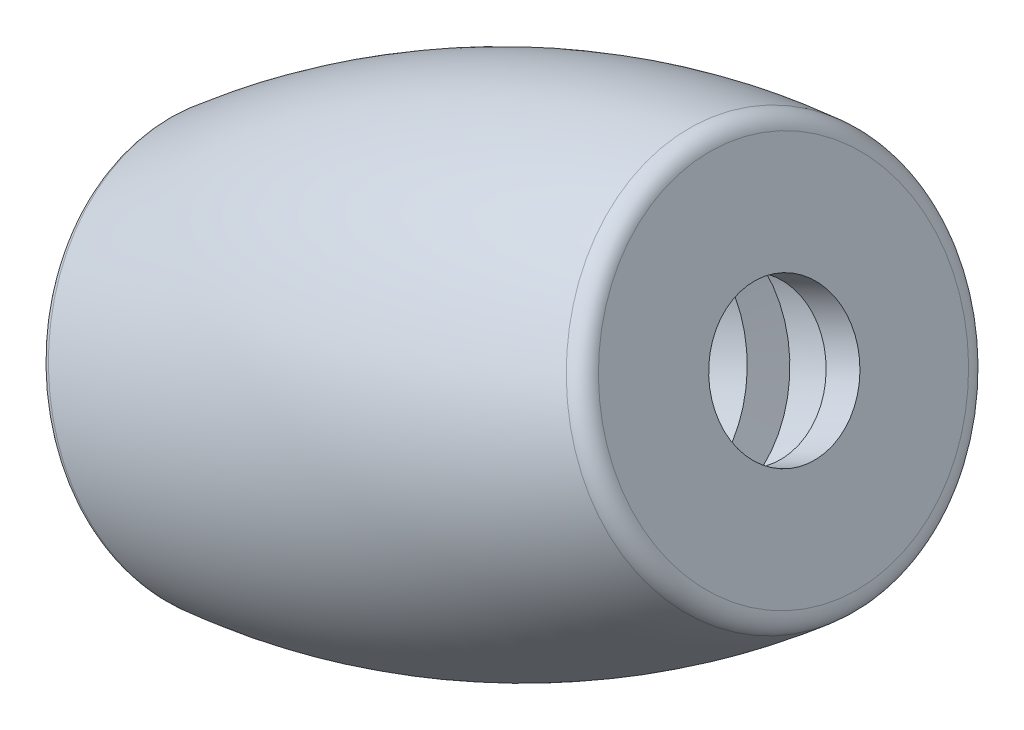
ISO-10303-21;
HEADER;
FILE_DESCRIPTION(('STEP AP214'),'2;1');
FILE_NAME('part.step','',(''),(''),'','','');
FILE_SCHEMA(('AUTOMOTIVE_DESIGN { 1 0 10303 214 1 1 1 1 }'));
ENDSEC;
DATA;
#1=APPLICATION_CONTEXT('core data for automotive mechanical design processes');
#2=APPLICATION_PROTOCOL_DEFINITION('international standard','automotive_design',2000,#1);
#3=PRODUCT_CONTEXT('',#1,'mechanical');
#4=PRODUCT('Part','Part','',(#3));
#5=PRODUCT_RELATED_PRODUCT_CATEGORY('part','',(#4));
#6=PRODUCT_DEFINITION_FORMATION('','',#4);
#7=PRODUCT_DEFINITION_CONTEXT('part definition',#1,'design');
#8=PRODUCT_DEFINITION('design','',#6,#7);
#9=PRODUCT_DEFINITION_SHAPE('','',#8);
#10=(LENGTH_UNIT() NAMED_UNIT(*) SI_UNIT(.MILLI.,.METRE.));
#11=(NAMED_UNIT(*) PLANE_ANGLE_UNIT() SI_UNIT($,.RADIAN.));
#12=(NAMED_UNIT(*) SI_UNIT($,.STERADIAN.) SOLID_ANGLE_UNIT());
#13=UNCERTAINTY_MEASURE_WITH_UNIT(LENGTH_MEASURE(1.E-05),#10,'distance_accuracy_value','');
#14=(GEOMETRIC_REPRESENTATION_CONTEXT(3) GLOBAL_UNCERTAINTY_ASSIGNED_CONTEXT((#13)) GLOBAL_UNIT_ASSIGNED_CONTEXT((#10,
#11,#12)) REPRESENTATION_CONTEXT('',''));
#15=CARTESIAN_POINT('',(0.,0.,0.));
#16=DIRECTION('',(0.,0.,1.));
#17=DIRECTION('',(1.,0.,0.));
#18=AXIS2_PLACEMENT_3D('',#15,#16,#17);
#19=CARTESIAN_POINT('',(10.863694172749,-21.4063109601106,0.));
#20=DIRECTION('',(-0.900968867902419,-0.433883739117558,0.));
#21=DIRECTION('',(0.433883739117558,-0.900968867902419,0.));
#22=AXIS2_PLACEMENT_3D('',#19,#20,#21);
#23=CONICAL_SURFACE('',#22,4.50000000025042,1.48352986418899);
#24=CARTESIAN_POINT('',(10.8636941727726,-21.4063109600992,0.));
#25=DIRECTION('',(0.90096886790242,0.433883739117557,0.));
#26=DIRECTION('',(-0.433883739117557,0.90096886790242,0.));
#27=AXIS2_PLACEMENT_3D('',#24,#25,#26);
#28=CIRCLE('',#27,4.5);
#29=CARTESIAN_POINT('',(8.9112173467436,-17.3519510545383,0.));
#30=VERTEX_POINT('',#29);
#31=EDGE_CURVE('E20',#30,#30,#28,.F.);
#32=ORIENTED_EDGE('',*,*,#31,.T.);
#33=EDGE_LOOP('',(#32));
#34=FACE_BOUND('',#33,.T.);
#35=CARTESIAN_POINT('',(10.9819310159695,-21.3493710974077,0.));
#36=DIRECTION('',(0.90096886790242,0.433883739117557,0.));
#37=DIRECTION('',(-0.433883739117557,0.90096886790242,0.));
#38=AXIS2_PLACEMENT_3D('',#35,#36,#37);
#39=CIRCLE('',#38,3.);
#40=CARTESIAN_POINT('',(9.68027979861681,-18.6464644937004,0.));
#41=VERTEX_POINT('',#40);
#42=EDGE_CURVE('E87',#41,#41,#39,.T.);
#43=ORIENTED_EDGE('',*,*,#42,.T.);
#44=EDGE_LOOP('',(#43));
#45=FACE_BOUND('',#44,.T.);
#46=ADVANCED_FACE('F16',(#34,#45),#23,.F.);
#47=CARTESIAN_POINT('',(10.4132097388214,-21.623252829658,0.));
#48=DIRECTION('',(0.90096886790242,0.433883739117557,0.));
#49=DIRECTION('',(-0.433883739117557,0.90096886790242,0.));
#50=AXIS2_PLACEMENT_3D('',#47,#48,#49);
#51=CYLINDRICAL_SURFACE('',#50,4.5);
#52=CARTESIAN_POINT('',(9.96272530487067,-21.8401946992166,0.));
#53=DIRECTION('',(0.90096886790242,0.433883739117557,0.));
#54=DIRECTION('',(0.400501160442044,-0.831649229009957,0.384653584893889));
#55=AXIS2_PLACEMENT_3D('',#52,#53,#54);
#56=CIRCLE('',#55,4.50000000007805);
#57=CARTESIAN_POINT('',(11.7649805268911,-25.5826162298263,1.73094113205252));
#58=VERTEX_POINT('',#57);
#59=EDGE_CURVE('E85',#58,#58,#56,.F.);
#60=ORIENTED_EDGE('',*,*,#59,.T.);
#61=EDGE_LOOP('',(#60));
#62=FACE_BOUND('',#61,.T.);
#63=ORIENTED_EDGE('',*,*,#31,.F.);
#64=EDGE_LOOP('',(#63));
#65=FACE_BOUND('',#64,.T.);
#66=ADVANCED_FACE('F95',(#62,#65),#51,.F.);
#67=CARTESIAN_POINT('',(12.2601959180214,-20.733791164467,0.));
#68=DIRECTION('',(0.90096886790242,0.433883739117557,0.));
#69=DIRECTION('',(-0.433883739117557,0.90096886790242,0.));
#70=AXIS2_PLACEMENT_3D('',#67,#68,#69);
#71=CYLINDRICAL_SURFACE('',#70,3.);
#72=ORIENTED_EDGE('',*,*,#42,.F.);
#73=EDGE_LOOP('',(#72));
#74=FACE_BOUND('',#73,.T.);
#75=CARTESIAN_POINT('',(13.5384608201111,-20.1182112315081,0.));
#76=DIRECTION('',(0.90096886790242,0.433883739117557,0.));
#77=DIRECTION('',(0.400501160440226,-0.831649229006182,0.384653584903945));
#78=AXIS2_PLACEMENT_3D('',#75,#76,#77);
#79=CIRCLE('',#78,3.00000000002287);
#80=CARTESIAN_POINT('',(14.739964301441,-22.6131589185457,1.15396075472063));
#81=VERTEX_POINT('',#80);
#82=EDGE_CURVE('E82',#81,#81,#79,.T.);
#83=ORIENTED_EDGE('',*,*,#82,.T.);
#84=EDGE_LOOP('',(#83));
#85=FACE_BOUND('',#84,.T.);
#86=ADVANCED_FACE('F97',(#74,#85),#71,.F.);
#87=CARTESIAN_POINT('',(9.96272530489459,-21.840194699205,0.));
#88=DIRECTION('',(0.90096886790242,0.433883739117557,0.));
#89=DIRECTION('',(-0.433883739117557,0.90096886790242,0.));
#90=AXIS2_PLACEMENT_3D('',#87,#88,#89);
#91=CONICAL_SURFACE('',#90,4.50000000015902,1.48352986418825);
#92=ORIENTED_EDGE('',*,*,#59,.F.);
#93=EDGE_LOOP('',(#92));
#94=FACE_BOUND('',#93,.T.);
#95=CARTESIAN_POINT('',(9.84448846167332,-21.8971345619083,0.));
#96=DIRECTION('',(0.90096886790242,0.433883739117557,0.));
#97=DIRECTION('',(-0.433883739117557,0.90096886790242,0.));
#98=AXIS2_PLACEMENT_3D('',#95,#96,#97);
#99=CIRCLE('',#98,3.);
#100=CARTESIAN_POINT('',(8.54283724432065,-19.1942279582011,0.));
#101=VERTEX_POINT('',#100);
#102=EDGE_CURVE('E79',#101,#101,#99,.F.);
#103=ORIENTED_EDGE('',*,*,#102,.T.);
#104=EDGE_LOOP('',(#103));
#105=FACE_BOUND('',#104,.T.);
#106=ADVANCED_FACE('F105',(#94,#105),#91,.F.);
#107=CARTESIAN_POINT('',(13.6566976632789,-20.0612713688306,0.));
#108=DIRECTION('',(0.90096886790242,0.433883739117557,0.));
#109=DIRECTION('',(-0.433883739117557,0.90096886790242,0.));
#110=AXIS2_PLACEMENT_3D('',#107,#108,#109);
#111=CONICAL_SURFACE('',#110,4.50000000007235,1.48352986421338);
#112=CARTESIAN_POINT('',(13.6566976632701,-20.0612713688348,0.));
#113=DIRECTION('',(0.90096886790242,0.433883739117557,0.));
#114=DIRECTION('',(-0.433883739117557,0.90096886790242,0.));
#115=AXIS2_PLACEMENT_3D('',#112,#113,#114);
#116=CIRCLE('',#115,4.5);
#117=CARTESIAN_POINT('',(11.7042208372411,-16.0069114632739,0.));
#118=VERTEX_POINT('',#117);
#119=EDGE_CURVE('E76',#118,#118,#116,.T.);
#120=ORIENTED_EDGE('',*,*,#119,.T.);
#121=EDGE_LOOP('',(#120));
#122=FACE_BOUND('',#121,.T.);
#123=ORIENTED_EDGE('',*,*,#82,.F.);
#124=EDGE_LOOP('',(#123));
#125=FACE_BOUND('',#124,.T.);
#126=ADVANCED_FACE('F212',(#122,#125),#111,.F.);
#127=CARTESIAN_POINT('',(8.56622355962144,-22.512714494849,0.));
#128=DIRECTION('',(0.90096886790242,0.433883739117557,0.));
#129=DIRECTION('',(-0.433883739117557,0.90096886790242,0.));
#130=AXIS2_PLACEMENT_3D('',#127,#128,#129);
#131=CYLINDRICAL_SURFACE('',#130,3.);
#132=ORIENTED_EDGE('',*,*,#102,.F.);
#133=EDGE_LOOP('',(#132));
#134=FACE_BOUND('',#133,.T.);
#135=CARTESIAN_POINT('',(7.28795865755641,-23.128294427796,0.));
#136=DIRECTION('',(-0.90096886790242,-0.433883739117557,0.));
#137=DIRECTION('',(-0.400501160443641,0.831649229013272,-0.384653584885059));
#138=AXIS2_PLACEMENT_3D('',#135,#136,#137);
#139=CIRCLE('',#138,3.00000000002237);
#140=CARTESIAN_POINT('',(6.08645517621653,-20.6333467407376,-1.15396075466379));
#141=VERTEX_POINT('',#140);
#142=EDGE_CURVE('E73',#141,#141,#139,.T.);
#143=ORIENTED_EDGE('',*,*,#142,.T.);
#144=EDGE_LOOP('',(#143));
#145=FACE_BOUND('',#144,.T.);
#146=ADVANCED_FACE('F208',(#134,#145),#131,.F.);
#147=CARTESIAN_POINT('',(14.1071820972213,-19.844329499276,0.));
#148=DIRECTION('',(0.90096886790242,0.433883739117557,0.));
#149=DIRECTION('',(-0.433883739117557,0.90096886790242,0.));
#150=AXIS2_PLACEMENT_3D('',#147,#148,#149);
#151=CYLINDRICAL_SURFACE('',#150,4.5);
#152=CARTESIAN_POINT('',(14.5576665311384,-19.6273876297337,0.));
#153=DIRECTION('',(-0.90096886790242,-0.433883739117557,0.));
#154=DIRECTION('',(-0.400501160441244,0.831649229008295,-0.384653584898316));
#155=AXIS2_PLACEMENT_3D('',#152,#153,#154);
#156=CIRCLE('',#155,4.49999999995236);
#157=CARTESIAN_POINT('',(12.7554113091719,-15.884966099236,-1.7309411320241));
#158=VERTEX_POINT('',#157);
#159=EDGE_CURVE('E70',#158,#158,#156,.F.);
#160=ORIENTED_EDGE('',*,*,#159,.T.);
#161=EDGE_LOOP('',(#160));
#162=FACE_BOUND('',#161,.T.);
#163=ORIENTED_EDGE('',*,*,#119,.F.);
#164=EDGE_LOOP('',(#163));
#165=FACE_BOUND('',#164,.T.);
#166=ADVANCED_FACE('F204',(#162,#165),#151,.F.);
#167=CARTESIAN_POINT('',(7.16972181439209,-23.1852342904719,0.));
#168=DIRECTION('',(-0.90096886790242,-0.433883739117557,0.));
#169=DIRECTION('',(0.433883739117557,-0.900968867902419,0.));
#170=AXIS2_PLACEMENT_3D('',#167,#168,#169);
#171=CONICAL_SURFACE('',#170,4.49999999980443,1.48352986420123);
#172=ORIENTED_EDGE('',*,*,#142,.F.);
#173=EDGE_LOOP('',(#172));
#174=FACE_BOUND('',#173,.T.);
#175=CARTESIAN_POINT('',(7.16972181437269,-23.1852342904812,0.));
#176=DIRECTION('',(0.90096886790242,0.433883739117557,0.));
#177=DIRECTION('',(-0.433883739117557,0.90096886790242,0.));
#178=AXIS2_PLACEMENT_3D('',#175,#176,#177);
#179=CIRCLE('',#178,4.5);
#180=CARTESIAN_POINT('',(5.21724498834368,-19.1308743849203,0.));
#181=VERTEX_POINT('',#180);
#182=EDGE_CURVE('E67',#181,#181,#179,.F.);
#183=ORIENTED_EDGE('',*,*,#182,.T.);
#184=EDGE_LOOP('',(#183));
#185=FACE_BOUND('',#184,.T.);
#186=ADVANCED_FACE('F200',(#174,#185),#171,.F.);
#187=CARTESIAN_POINT('',(14.5576665311623,-19.6273876297221,0.));
#188=DIRECTION('',(-0.90096886790242,-0.433883739117557,0.));
#189=DIRECTION('',(0.433883739117557,-0.900968867902419,0.));
#190=AXIS2_PLACEMENT_3D('',#187,#188,#189);
#191=CONICAL_SURFACE('',#190,4.49999999987139,1.4835298642072);
#192=ORIENTED_EDGE('',*,*,#159,.F.);
#193=EDGE_LOOP('',(#192));
#194=FACE_BOUND('',#193,.T.);
#195=CARTESIAN_POINT('',(14.6759033743694,-19.5704477670257,0.));
#196=DIRECTION('',(0.90096886790242,0.433883739117557,0.));
#197=DIRECTION('',(-0.433883739117557,0.90096886790242,0.));
#198=AXIS2_PLACEMENT_3D('',#195,#196,#197);
#199=CIRCLE('',#198,3.);
#200=CARTESIAN_POINT('',(13.3742521570167,-16.8675411633184,0.));
#201=VERTEX_POINT('',#200);
#202=EDGE_CURVE('E64',#201,#201,#199,.T.);
#203=ORIENTED_EDGE('',*,*,#202,.T.);
#204=EDGE_LOOP('',(#203));
#205=FACE_BOUND('',#204,.T.);
#206=ADVANCED_FACE('F196',(#194,#205),#191,.F.);
#207=CARTESIAN_POINT('',(6.71923738042148,-23.40217616004,0.));
#208=DIRECTION('',(0.90096886790242,0.433883739117557,0.));
#209=DIRECTION('',(-0.433883739117557,0.90096886790242,0.));
#210=AXIS2_PLACEMENT_3D('',#207,#208,#209);
#211=CYLINDRICAL_SURFACE('',#210,4.5);
#212=CARTESIAN_POINT('',(6.26875294646077,-23.6191180296033,0.));
#213=DIRECTION('',(0.90096886790242,0.433883739117557,0.));
#214=DIRECTION('',(0.400501160442265,-0.831649229010416,0.384653584892667));
#215=AXIS2_PLACEMENT_3D('',#212,#213,#214);
#216=CIRCLE('',#215,4.49999999994457);
#217=CARTESIAN_POINT('',(8.07100816842876,-27.3615395601041,1.73094113199568));
#218=VERTEX_POINT('',#217);
#219=EDGE_CURVE('E48',#218,#218,#216,.F.);
#220=ORIENTED_EDGE('',*,*,#219,.T.);
#221=EDGE_LOOP('',(#220));
#222=FACE_BOUND('',#221,.T.);
#223=ORIENTED_EDGE('',*,*,#182,.F.);
#224=EDGE_LOOP('',(#223));
#225=FACE_BOUND('',#224,.T.);
#226=ADVANCED_FACE('F192',(#222,#225),#211,.F.);
#227=CARTESIAN_POINT('',(15.3265838298847,-19.2570965746954,0.));
#228=DIRECTION('',(0.90096886790242,0.433883739117557,0.));
#229=DIRECTION('',(-0.433883739117557,0.90096886790242,0.));
#230=AXIS2_PLACEMENT_3D('',#227,#228,#229);
#231=CYLINDRICAL_SURFACE('',#230,3.);
#232=ORIENTED_EDGE('',*,*,#202,.F.);
#233=EDGE_LOOP('',(#232));
#234=FACE_BOUND('',#233,.T.);
#235=CARTESIAN_POINT('',(15.9772642853955,-18.9437453823673,0.));
#236=DIRECTION('',(0.90096886790242,0.433883739117557,0.));
#237=DIRECTION('',(0.400501160441547,-0.831649229008926,0.384653584896635));
#238=AXIS2_PLACEMENT_3D('',#235,#236,#237);
#239=CIRCLE('',#238,3.000000000006);
#240=CARTESIAN_POINT('',(14.7757608041056,-16.448797695478,-1.15396075463879));
#241=VERTEX_POINT('',#240);
#242=CARTESIAN_POINT('',(17.1787677668229,-21.4386930695304,1.1539607547559));
#243=VERTEX_POINT('',#242);
#244=EDGE_CURVE('E50',#241,#243,#239,.T.);
#245=ORIENTED_EDGE('',*,*,#244,.T.);
#246=CARTESIAN_POINT('',(15.9772642853955,-18.9437453823673,0.));
#247=DIRECTION('',(0.90096886790242,0.433883739117557,0.));
#248=DIRECTION('',(0.400501160441547,-0.831649229008926,0.384653584896635));
#249=AXIS2_PLACEMENT_3D('',#246,#247,#248);
#250=CIRCLE('',#249,3.000000000006);
#251=EDGE_CURVE('E42',#243,#241,#250,.T.);
#252=ORIENTED_EDGE('',*,*,#251,.T.);
#253=EDGE_LOOP('',(#245,#252));
#254=FACE_BOUND('',#253,.T.);
#255=ADVANCED_FACE('F51',(#234,#254),#231,.F.);
#256=CARTESIAN_POINT('',(6.26875294643685,-23.6191180296149,0.));
#257=DIRECTION('',(0.90096886790242,0.433883739117557,0.));
#258=DIRECTION('',(-0.433883739117557,0.90096886790242,0.));
#259=AXIS2_PLACEMENT_3D('',#256,#257,#258);
#260=CONICAL_SURFACE('',#259,4.49999999985266,1.4835298642004);
#261=ORIENTED_EDGE('',*,*,#219,.F.);
#262=EDGE_LOOP('',(#261));
#263=FACE_BOUND('',#262,.T.);
#264=CARTESIAN_POINT('',(6.1505161032734,-23.6760578922903,0.));
#265=DIRECTION('',(0.90096886790242,0.433883739117557,0.));
#266=DIRECTION('',(-0.433883739117557,0.90096886790242,0.));
#267=AXIS2_PLACEMENT_3D('',#264,#265,#266);
#268=CIRCLE('',#267,3.);
#269=CARTESIAN_POINT('',(4.84886488592073,-20.9731512885831,0.));
#270=VERTEX_POINT('',#269);
#271=EDGE_CURVE('E53',#270,#270,#268,.F.);
#272=ORIENTED_EDGE('',*,*,#271,.T.);
#273=EDGE_LOOP('',(#272));
#274=FACE_BOUND('',#273,.T.);
#275=ADVANCED_FACE('F158',(#263,#274),#260,.F.);
#276=CARTESIAN_POINT('',(16.0442651632261,-18.9114794601662,0.));
#277=DIRECTION('',(0.900968867902419,0.433883739117558,0.));
#278=DIRECTION('',(-0.433883739117558,0.900968867902419,0.));
#279=AXIS2_PLACEMENT_3D('',#276,#277,#278);
#280=CONICAL_SURFACE('',#279,3.85000000020913,1.48352986418068);
#281=ORIENTED_EDGE('',*,*,#251,.F.);
#282=DIRECTION('',(-0.477501743481427,0.790669093066525,-0.383189861872097));
#283=VECTOR('',#282,1.);
#284=CARTESIAN_POINT('',(301360.857271546,-499000.,241826.119247785));
#285=LINE('',#284,#283);
#286=CARTESIAN_POINT('',(17.5861946309322,-22.1133289919192,1.48091630188118));
#287=VERTEX_POINT('',#286);
#288=EDGE_CURVE('E35',#243,#287,#285,.F.);
#289=ORIENTED_EDGE('',*,*,#288,.T.);
#290=CARTESIAN_POINT('',(16.0442651632115,-18.9114794601733,0.));
#291=DIRECTION('',(0.90096886790242,0.433883739117557,0.));
#292=DIRECTION('',(-0.433883739117557,0.90096886790242,0.));
#293=AXIS2_PLACEMENT_3D('',#290,#291,#292);
#294=CIRCLE('',#293,3.85);
#295=CARTESIAN_POINT('',(14.5023356954426,-15.7096299282988,-1.48091630190961));
#296=VERTEX_POINT('',#295);
#297=EDGE_CURVE('E153',#287,#296,#294,.T.);
#298=ORIENTED_EDGE('',*,*,#297,.T.);
#299=DIRECTION('',(0.320452521744527,-0.86630001216133,0.38318986186596));
#300=VECTOR('',#299,1.);
#301=CARTESIAN_POINT('',(-202217.662144554,546691.570421752,-241826.119243912));
#302=LINE('',#301,#300);
#303=EDGE_CURVE('E46',#296,#241,#302,.T.);
#304=ORIENTED_EDGE('',*,*,#303,.T.);
#305=EDGE_LOOP('',(#281,#289,#298,#304));
#306=FACE_BOUND('',#305,.T.);
#307=ADVANCED_FACE('F44',(#306),#280,.F.);
#308=CARTESIAN_POINT('',(16.0442651632073,-18.9114794601753,0.));
#309=DIRECTION('',(0.900968867902419,0.433883739117557,0.));
#310=DIRECTION('',(-0.433883739117557,0.900968867902419,0.));
#311=AXIS2_PLACEMENT_3D('',#308,#309,#310);
#312=CONICAL_SURFACE('',#311,3.85000000053476,1.48352986424886);
#313=ORIENTED_EDGE('',*,*,#303,.F.);
#314=CARTESIAN_POINT('',(16.0442651632115,-18.9114794601733,0.));
#315=DIRECTION('',(0.90096886790242,0.433883739117557,0.));
#316=DIRECTION('',(-0.433883739117557,0.90096886790242,0.));
#317=AXIS2_PLACEMENT_3D('',#314,#315,#316);
#318=CIRCLE('',#317,3.85);
#319=EDGE_CURVE('E57',#296,#287,#318,.T.);
#320=ORIENTED_EDGE('',*,*,#319,.T.);
#321=ORIENTED_EDGE('',*,*,#288,.F.);
#322=ORIENTED_EDGE('',*,*,#244,.F.);
#323=EDGE_LOOP('',(#313,#320,#321,#322));
#324=FACE_BOUND('',#323,.T.);
#325=ADVANCED_FACE('F55',(#324),#312,.F.);
#326=CARTESIAN_POINT('',(5.49983564775812,-23.9894090846206,0.));
#327=DIRECTION('',(0.90096886790242,0.433883739117557,0.));
#328=DIRECTION('',(-0.433883739117557,0.90096886790242,0.));
#329=AXIS2_PLACEMENT_3D('',#326,#327,#328);
#330=CYLINDRICAL_SURFACE('',#329,3.);
#331=ORIENTED_EDGE('',*,*,#271,.F.);
#332=EDGE_LOOP('',(#331));
#333=FACE_BOUND('',#332,.T.);
#334=CARTESIAN_POINT('',(4.8491551922276,-24.3027602769582,0.));
#335=DIRECTION('',(-0.90096886790242,-0.433883739117557,0.));
#336=DIRECTION('',(-0.400501160441311,0.831649229008434,-0.384653584897945));
#337=AXIS2_PLACEMENT_3D('',#334,#335,#336);
#338=CIRCLE('',#337,2.99999999992188);
#339=CARTESIAN_POINT('',(3.64765171093495,-21.8078125899979,-1.15396075466379));
#340=VERTEX_POINT('',#339);
#341=EDGE_CURVE('E149',#340,#340,#338,.T.);
#342=ORIENTED_EDGE('',*,*,#341,.T.);
#343=EDGE_LOOP('',(#342));
#344=FACE_BOUND('',#343,.T.);
#345=ADVANCED_FACE('F160',(#333,#344),#330,.F.);
#346=CARTESIAN_POINT('',(16.4622005143181,-18.7102124027779,0.));
#347=DIRECTION('',(0.90096886790242,0.433883739117557,0.));
#348=DIRECTION('',(-0.433883739117557,0.90096886790242,0.));
#349=AXIS2_PLACEMENT_3D('',#346,#347,#348);
#350=CYLINDRICAL_SURFACE('',#349,3.85);
#351=CARTESIAN_POINT('',(16.8801358654113,-18.508945345389,0.));
#352=DIRECTION('',(-0.90096886790242,-0.433883739117557,0.));
#353=DIRECTION('',(-0.400501160442848,0.831649229011627,-0.38465358488944));
#354=AXIS2_PLACEMENT_3D('',#351,#352,#353);
#355=CIRCLE('',#354,3.85000000001441);
#356=CARTESIAN_POINT('',(15.3382063977006,-15.3070958136823,-1.48091630182989));
#357=VERTEX_POINT('',#356);
#358=EDGE_CURVE('E146',#357,#357,#355,.F.);
#359=ORIENTED_EDGE('',*,*,#358,.T.);
#360=EDGE_LOOP('',(#359));
#361=FACE_BOUND('',#360,.T.);
#362=ORIENTED_EDGE('',*,*,#319,.F.);
#363=ORIENTED_EDGE('',*,*,#297,.F.);
#364=EDGE_LOOP('',(#362,#363));
#365=FACE_BOUND('',#364,.T.);
#366=ADVANCED_FACE('F163',(#361,#365),#350,.F.);
#367=CARTESIAN_POINT('',(4.78215431439696,-24.3350261991593,0.));
#368=DIRECTION('',(-0.900968867902419,-0.433883739117557,0.));
#369=DIRECTION('',(0.433883739117557,-0.900968867902419,0.));
#370=AXIS2_PLACEMENT_3D('',#367,#368,#369);
#371=CONICAL_SURFACE('',#370,3.85000000011407,1.48352986419009);
#372=CARTESIAN_POINT('',(4.78215431443128,-24.3350261991427,0.));
#373=DIRECTION('',(0.90096886790242,0.433883739117557,0.));
#374=DIRECTION('',(-0.433883739117557,0.90096886790242,0.));
#375=AXIS2_PLACEMENT_3D('',#372,#373,#374);
#376=CIRCLE('',#375,3.85000000000001);
#377=CARTESIAN_POINT('',(3.11170191882868,-20.8662960577184,0.));
#378=VERTEX_POINT('',#377);
#379=EDGE_CURVE('E143',#378,#378,#376,.F.);
#380=ORIENTED_EDGE('',*,*,#379,.T.);
#381=EDGE_LOOP('',(#380));
#382=FACE_BOUND('',#381,.T.);
#383=ORIENTED_EDGE('',*,*,#341,.F.);
#384=EDGE_LOOP('',(#383));
#385=FACE_BOUND('',#384,.T.);
#386=ADVANCED_FACE('F167',(#382,#385),#371,.F.);
#387=CARTESIAN_POINT('',(16.8801358654113,-18.508945345389,0.));
#388=DIRECTION('',(-0.900968867902419,-0.433883739117558,0.));
#389=DIRECTION('',(0.433883739117558,-0.900968867902419,0.));
#390=AXIS2_PLACEMENT_3D('',#387,#388,#389);
#391=CONICAL_SURFACE('',#390,3.85000000001441,1.56206968054435);
#392=ORIENTED_EDGE('',*,*,#358,.F.);
#393=EDGE_LOOP('',(#392));
#394=FACE_BOUND('',#393,.T.);
#395=CARTESIAN_POINT('',(16.8958611378123,-18.5013724533269,0.));
#396=DIRECTION('',(0.90096886790242,0.433883739117557,0.));
#397=DIRECTION('',(-0.433883739117557,0.90096886790242,0.));
#398=AXIS2_PLACEMENT_3D('',#395,#396,#397);
#399=CIRCLE('',#398,1.85);
#400=CARTESIAN_POINT('',(16.0931762204448,-16.8345800477074,0.));
#401=VERTEX_POINT('',#400);
#402=EDGE_CURVE('E140',#401,#401,#399,.T.);
#403=ORIENTED_EDGE('',*,*,#402,.T.);
#404=EDGE_LOOP('',(#403));
#405=FACE_BOUND('',#404,.T.);
#406=ADVANCED_FACE('F169',(#394,#405),#391,.F.);
#407=CARTESIAN_POINT('',(4.03885499841178,-24.6929802839147,0.));
#408=DIRECTION('',(0.90096886790242,0.433883739117557,0.));
#409=DIRECTION('',(-0.433883739117557,0.90096886790242,0.));
#410=AXIS2_PLACEMENT_3D('',#407,#408,#409);
#411=CYLINDRICAL_SURFACE('',#410,3.85000000000001);
#412=ORIENTED_EDGE('',*,*,#379,.F.);
#413=EDGE_LOOP('',(#412));
#414=FACE_BOUND('',#413,.T.);
#415=CARTESIAN_POINT('',(3.29555568241367,-25.0509343686764,0.));
#416=DIRECTION('',(0.90096886790242,0.433883739117557,0.));
#417=DIRECTION('',(0.400501160440426,-0.831649229006597,0.384653584902839));
#418=AXIS2_PLACEMENT_3D('',#415,#416,#417);
#419=CIRCLE('',#418,3.8499999999542);
#420=CARTESIAN_POINT('',(4.83748515009097,-28.2527839003137,1.48091630185831));
#421=VERTEX_POINT('',#420);
#422=EDGE_CURVE('E137',#421,#421,#419,.T.);
#423=ORIENTED_EDGE('',*,*,#422,.F.);
#424=EDGE_LOOP('',(#423));
#425=FACE_BOUND('',#424,.T.);
#426=ADVANCED_FACE('F176',(#414,#425),#411,.F.);
#427=CARTESIAN_POINT('',(17.3463455717635,-18.2844305837681,0.));
#428=DIRECTION('',(0.90096886790242,0.433883739117557,0.));
#429=DIRECTION('',(-0.433883739117557,0.90096886790242,0.));
#430=AXIS2_PLACEMENT_3D('',#427,#428,#429);
#431=CYLINDRICAL_SURFACE('',#430,1.85);
#432=ORIENTED_EDGE('',*,*,#402,.F.);
#433=EDGE_LOOP('',(#432));
#434=FACE_BOUND('',#433,.T.);
#435=CARTESIAN_POINT('',(17.796830005682,-18.0674887142251,0.));
#436=DIRECTION('',(-0.90096886790242,-0.433883739117557,0.));
#437=DIRECTION('',(-0.400501160437948,0.831649229001452,-0.384653584916541));
#438=AXIS2_PLACEMENT_3D('',#435,#436,#437);
#439=CIRCLE('',#438,1.84999999996582);
#440=CARTESIAN_POINT('',(17.0559028588855,-16.5289376406008,-0.711609132082458));
#441=VERTEX_POINT('',#440);
#442=EDGE_CURVE('E134',#441,#441,#439,.T.);
#443=ORIENTED_EDGE('',*,*,#442,.F.);
#444=EDGE_LOOP('',(#443));
#445=FACE_BOUND('',#444,.T.);
#446=ADVANCED_FACE('F303',(#434,#445),#431,.F.);
#447=CARTESIAN_POINT('',(3.30087362287732,-25.0483733835248,0.));
#448=DIRECTION('',(0.90096886790242,0.433883739117557,0.));
#449=DIRECTION('',(-0.433883739117557,0.90096886790242,0.));
#450=AXIS2_PLACEMENT_3D('',#447,#448,#449);
#451=CONICAL_SURFACE('',#450,4.52635591512487,1.56206968059211);
#452=ORIENTED_EDGE('',*,*,#422,.T.);
#453=EDGE_LOOP('',(#452));
#454=FACE_BOUND('',#453,.T.);
#455=CARTESIAN_POINT('',(3.30087362287696,-25.048373383525,0.));
#456=DIRECTION('',(0.900968867902419,0.433883739117557,0.));
#457=DIRECTION('',(-0.400501160442296,0.831649229010479,-0.384653584892498));
#458=AXIS2_PLACEMENT_3D('',#455,#456,#457);
#459=CIRCLE('',#458,4.52635591341324);
#460=CARTESIAN_POINT('',(1.48806282698011,-21.2840329779078,-1.74107902859377));
#461=VERTEX_POINT('',#460);
#462=EDGE_CURVE('E131',#461,#461,#459,.T.);
#463=ORIENTED_EDGE('',*,*,#462,.F.);
#464=EDGE_LOOP('',(#463));
#465=FACE_BOUND('',#464,.T.);
#466=ADVANCED_FACE('F312',(#454,#465),#451,.T.);
#467=CARTESIAN_POINT('',(17.7757867928217,-18.0776225914367,0.));
#468=DIRECTION('',(-0.90096886790242,-0.433883739117557,0.));
#469=DIRECTION('',(0.433883739117557,-0.90096886790242,0.));
#470=AXIS2_PLACEMENT_3D('',#467,#468,#469);
#471=CONICAL_SURFACE('',#470,4.52635591391673,1.56206968054131);
#472=ORIENTED_EDGE('',*,*,#442,.T.);
#473=EDGE_LOOP('',(#472));
#474=FACE_BOUND('',#473,.T.);
#475=CARTESIAN_POINT('',(17.7757867928381,-18.0776225914289,0.));
#476=DIRECTION('',(-0.90096886790242,-0.433883739117557,0.));
#477=DIRECTION('',(-0.400501160442295,0.831649229010479,-0.384653584892499));
#478=AXIS2_PLACEMENT_3D('',#475,#476,#477);
#479=CIRCLE('',#478,4.52635591396752);
#480=CARTESIAN_POINT('',(15.9629759967192,-14.3132821853508,-1.74107902880698));
#481=VERTEX_POINT('',#480);
#482=EDGE_CURVE('E128',#481,#481,#479,.T.);
#483=ORIENTED_EDGE('',*,*,#482,.F.);
#484=EDGE_LOOP('',(#483));
#485=FACE_BOUND('',#484,.T.);
#486=ADVANCED_FACE('F123',(#474,#485),#471,.T.);
#487=CARTESIAN_POINT('',(3.75134090376016,-24.8314397744484,0.));
#488=DIRECTION('',(0.90096886790242,0.433883739117557,0.));
#489=DIRECTION('',(-0.433883739117557,0.90096886790242,0.));
#490=AXIS2_PLACEMENT_3D('',#487,#488,#489);
#491=TOROIDAL_SURFACE('',#490,4.521992645522,0.499999999999998);
#492=ORIENTED_EDGE('',*,*,#462,.T.);
#493=EDGE_LOOP('',(#492));
#494=FACE_BOUND('',#493,.T.);
#495=CARTESIAN_POINT('',(3.63630718674153,-24.8868370928716,0.));
#496=DIRECTION('',(0.90096886790242,0.433883739117557,0.));
#497=DIRECTION('',(0.400501160442296,-0.831649229010479,0.384653584892498));
#498=AXIS2_PLACEMENT_3D('',#495,#496,#497);
#499=CIRCLE('',#498,5.0054162496834);
#500=CARTESIAN_POINT('',(5.64098220323646,-29.0495876577974,1.92535130431988));
#501=VERTEX_POINT('',#500);
#502=EDGE_CURVE('E26',#501,#501,#499,.T.);
#503=ORIENTED_EDGE('',*,*,#502,.F.);
#504=EDGE_LOOP('',(#503));
#505=FACE_BOUND('',#504,.T.);
#506=ADVANCED_FACE('F117',(#494,#505),#491,.T.);
#507=CARTESIAN_POINT('',(17.3253195119592,-18.2945562005034,0.));
#508=DIRECTION('',(0.90096886790242,0.433883739117557,0.));
#509=DIRECTION('',(-0.433883739117557,0.90096886790242,0.));
#510=AXIS2_PLACEMENT_3D('',#507,#508,#509);
#511=TOROIDAL_SURFACE('',#510,4.52199264552202,0.49999999999999);
#512=ORIENTED_EDGE('',*,*,#482,.T.);
#513=EDGE_LOOP('',(#512));
#514=FACE_BOUND('',#513,.T.);
#515=CARTESIAN_POINT('',(17.4403532289779,-18.2391588820801,0.));
#516=DIRECTION('',(0.90096886790242,0.433883739117557,0.));
#517=DIRECTION('',(0.400501160442295,-0.83164922901048,0.384653584892497));
#518=AXIS2_PLACEMENT_3D('',#515,#516,#517);
#519=CIRCLE('',#518,5.0054162496834);
#520=CARTESIAN_POINT('',(19.4450282454728,-22.4019094470058,1.92535130431987));
#521=VERTEX_POINT('',#520);
#522=EDGE_CURVE('E11',#521,#521,#519,.F.);
#523=ORIENTED_EDGE('',*,*,#522,.F.);
#524=EDGE_LOOP('',(#523));
#525=FACE_BOUND('',#524,.T.);
#526=ADVANCED_FACE('F18',(#514,#525),#511,.T.);
#527=CARTESIAN_POINT('',(0.926302357244555,-1.60341649122425,-9.23168603742001));
#528=DIRECTION('',(0.16689493567813,-0.346560904915201,-0.923061005367116));
#529=DIRECTION('',(0.400501160442296,-0.831649229010479,0.384653584892498));
#530=AXIS2_PLACEMENT_3D('',#527,#528,#529);
#531=CIRCLE('',#530,30.0000000000002);
#532=TRIMMED_CURVE('',#531,(PARAMETER_VALUE(-0.643501108793283)),
(PARAMETER_VALUE(0.643501108793283)),.T.,.PARAMETER.);
#533=CARTESIAN_POINT('',(10.5383302078597,-21.5629979874759,0.));
#534=DIRECTION('',(0.90096886790242,0.433883739117557,0.));
#535=AXIS1_PLACEMENT('',#533,#534);
#536=SURFACE_OF_REVOLUTION('',#532,#535);
#537=ORIENTED_EDGE('',*,*,#502,.T.);
#538=EDGE_LOOP('',(#537));
#539=FACE_BOUND('',#538,.T.);
#540=ORIENTED_EDGE('',*,*,#522,.T.);
#541=EDGE_LOOP('',(#540));
#542=FACE_BOUND('',#541,.T.);
#543=ADVANCED_FACE('F110',(#539,#542),#536,.F.);
#544=CLOSED_SHELL('',(#46,#66,#86,#106,#126,#146,#166,#186,#206,#226,#255,#275,#307,#325,#345,
#366,#386,#406,#426,#446,#466,#486,#506,#526,#543));
#545=MANIFOLD_SOLID_BREP('B1',#544);
#546=ADVANCED_BREP_SHAPE_REPRESENTATION('',(#18,#545),#14);
#547=SHAPE_DEFINITION_REPRESENTATION(#9,#546);
ENDSEC;
END-ISO-10303-21;
